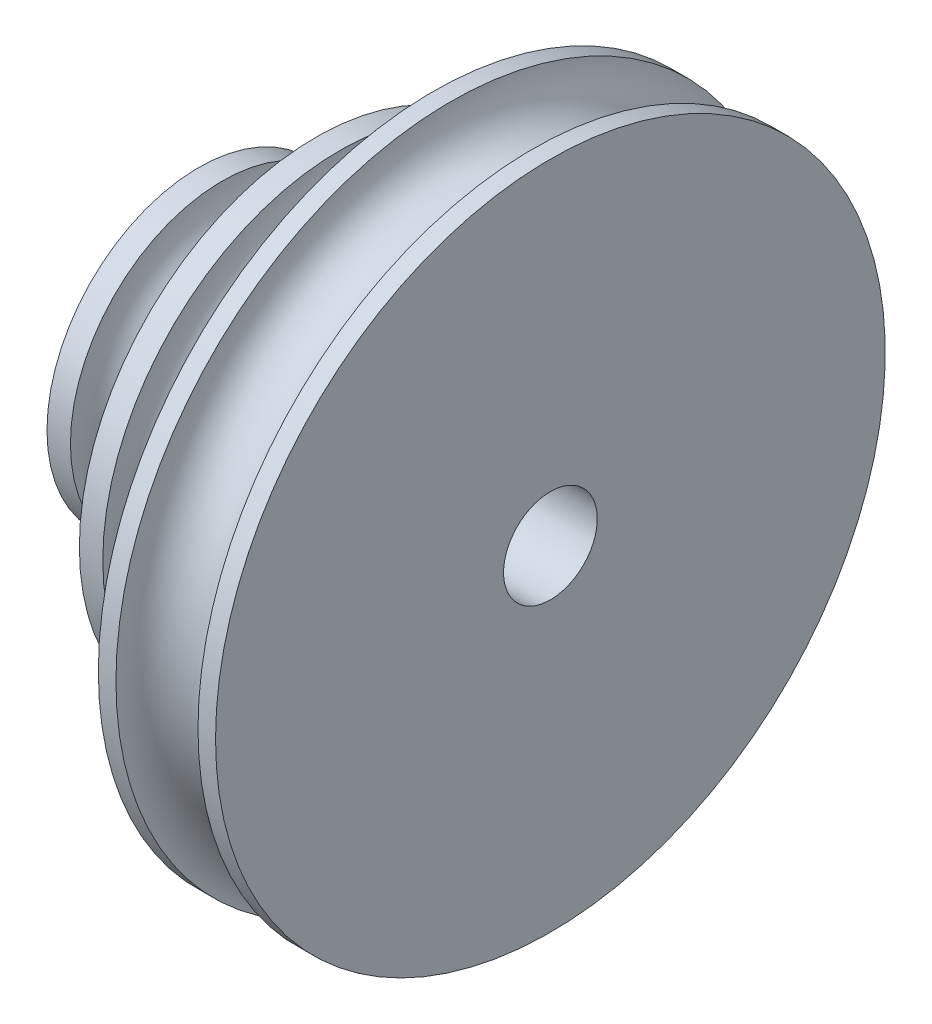
ISO-10303-21;
HEADER;
FILE_DESCRIPTION(('STEP AP214'),'2;1');
FILE_NAME('part.step','',(''),(''),'','','');
FILE_SCHEMA(('AUTOMOTIVE_DESIGN { 1 0 10303 214 1 1 1 1 }'));
ENDSEC;
DATA;
#1=APPLICATION_CONTEXT('core data for automotive mechanical design processes');
#2=APPLICATION_PROTOCOL_DEFINITION('international standard','automotive_design',2000,#1);
#3=PRODUCT_CONTEXT('',#1,'mechanical');
#4=PRODUCT('Part','Part','',(#3));
#5=PRODUCT_RELATED_PRODUCT_CATEGORY('part','',(#4));
#6=PRODUCT_DEFINITION_FORMATION('','',#4);
#7=PRODUCT_DEFINITION_CONTEXT('part definition',#1,'design');
#8=PRODUCT_DEFINITION('design','',#6,#7);
#9=PRODUCT_DEFINITION_SHAPE('','',#8);
#10=(LENGTH_UNIT() NAMED_UNIT(*) SI_UNIT(.MILLI.,.METRE.));
#11=(NAMED_UNIT(*) PLANE_ANGLE_UNIT() SI_UNIT($,.RADIAN.));
#12=(NAMED_UNIT(*) SI_UNIT($,.STERADIAN.) SOLID_ANGLE_UNIT());
#13=UNCERTAINTY_MEASURE_WITH_UNIT(LENGTH_MEASURE(1.E-05),#10,'distance_accuracy_value','');
#14=(GEOMETRIC_REPRESENTATION_CONTEXT(3) GLOBAL_UNCERTAINTY_ASSIGNED_CONTEXT((#13)) GLOBAL_UNIT_ASSIGNED_CONTEXT((#10,
#11,#12)) REPRESENTATION_CONTEXT('',''));
#15=CARTESIAN_POINT('',(0.,0.,0.));
#16=DIRECTION('',(0.,0.,1.));
#17=DIRECTION('',(1.,0.,0.));
#18=AXIS2_PLACEMENT_3D('',#15,#16,#17);
#19=CARTESIAN_POINT('',(-56.8989202459507,20.9428416164091,0.));
#20=DIRECTION('',(-1.,0.,0.));
#21=DIRECTION('',(0.,0.,1.));
#22=AXIS2_PLACEMENT_3D('',#19,#20,#21);
#23=CYLINDRICAL_SURFACE('',#22,20.1904761904762);
#24=CARTESIAN_POINT('',(-20.9941583411889,20.9428416164091,0.));
#25=DIRECTION('',(-1.,0.,0.));
#26=DIRECTION('',(0.,0.,1.));
#27=AXIS2_PLACEMENT_3D('',#24,#25,#26);
#28=CIRCLE('',#27,20.1904761904762);
#29=CARTESIAN_POINT('',(-20.9941583411889,20.9428416164091,20.1904761904762));
#30=VERTEX_POINT('',#29);
#31=EDGE_CURVE('E44',#30,#30,#28,.T.);
#32=ORIENTED_EDGE('',*,*,#31,.F.);
#33=EDGE_LOOP('',(#32));
#34=FACE_BOUND('',#33,.T.);
#35=CARTESIAN_POINT('',(-18.9941583411889,20.9428416164091,0.));
#36=DIRECTION('',(-1.,0.,0.));
#37=DIRECTION('',(0.,0.,1.));
#38=AXIS2_PLACEMENT_3D('',#35,#36,#37);
#39=CIRCLE('',#38,20.1904761904762);
#40=CARTESIAN_POINT('',(-18.9941583411889,20.9428416164091,20.1904761904762));
#41=VERTEX_POINT('',#40);
#42=EDGE_CURVE('E69',#41,#41,#39,.T.);
#43=ORIENTED_EDGE('',*,*,#42,.T.);
#44=EDGE_LOOP('',(#43));
#45=FACE_BOUND('',#44,.T.);
#46=ADVANCED_FACE('F33',(#34,#45),#23,.T.);
#47=CARTESIAN_POINT('',(-56.8989202459507,20.9428416164091,0.));
#48=DIRECTION('',(-1.,0.,0.));
#49=DIRECTION('',(0.,0.,1.));
#50=AXIS2_PLACEMENT_3D('',#47,#48,#49);
#51=CYLINDRICAL_SURFACE('',#50,28.5714285714285);
#52=CARTESIAN_POINT('',(-0.994158341188892,20.9428416164091,0.));
#53=DIRECTION('',(-1.,0.,0.));
#54=DIRECTION('',(0.,0.,1.));
#55=AXIS2_PLACEMENT_3D('',#52,#53,#54);
#56=CIRCLE('',#55,28.5714285714285);
#57=CARTESIAN_POINT('',(-0.994158341188892,20.9428416164091,28.5714285714285));
#58=VERTEX_POINT('',#57);
#59=EDGE_CURVE('E53',#58,#58,#56,.T.);
#60=ORIENTED_EDGE('',*,*,#59,.T.);
#61=EDGE_LOOP('',(#60));
#62=FACE_BOUND('',#61,.T.);
#63=CARTESIAN_POINT('',(-2.49415834118889,20.9428416164091,0.));
#64=DIRECTION('',(-1.,0.,0.));
#65=DIRECTION('',(0.,0.,1.));
#66=AXIS2_PLACEMENT_3D('',#63,#64,#65);
#67=CIRCLE('',#66,28.5714285714285);
#68=CARTESIAN_POINT('',(-2.49415834118889,20.9428416164091,28.5714285714285));
#69=VERTEX_POINT('',#68);
#70=EDGE_CURVE('E66',#69,#69,#67,.T.);
#71=ORIENTED_EDGE('',*,*,#70,.F.);
#72=EDGE_LOOP('',(#71));
#73=FACE_BOUND('',#72,.T.);
#74=ADVANCED_FACE('F93',(#62,#73),#51,.T.);
#75=CARTESIAN_POINT('',(-56.8989202459507,20.9428416164091,0.));
#76=DIRECTION('',(-1.,0.,0.));
#77=DIRECTION('',(0.,0.,1.));
#78=AXIS2_PLACEMENT_3D('',#75,#76,#77);
#79=CYLINDRICAL_SURFACE('',#78,12.9523809523809);
#80=CARTESIAN_POINT('',(-30.9941583411889,20.9428416164091,0.));
#81=DIRECTION('',(-1.,0.,0.));
#82=DIRECTION('',(0.,0.,1.));
#83=AXIS2_PLACEMENT_3D('',#80,#81,#82);
#84=CIRCLE('',#83,12.9523809523809);
#85=CARTESIAN_POINT('',(-30.9941583411889,20.9428416164091,12.9523809523809));
#86=VERTEX_POINT('',#85);
#87=EDGE_CURVE('E40',#86,#86,#84,.T.);
#88=ORIENTED_EDGE('',*,*,#87,.F.);
#89=EDGE_LOOP('',(#88));
#90=FACE_BOUND('',#89,.T.);
#91=CARTESIAN_POINT('',(-28.9941583411889,20.9428416164091,0.));
#92=DIRECTION('',(-1.,0.,0.));
#93=DIRECTION('',(0.,0.,1.));
#94=AXIS2_PLACEMENT_3D('',#91,#92,#93);
#95=CIRCLE('',#94,12.9523809523809);
#96=CARTESIAN_POINT('',(-28.9941583411889,20.9428416164091,12.9523809523809));
#97=VERTEX_POINT('',#96);
#98=EDGE_CURVE('E62',#97,#97,#95,.T.);
#99=ORIENTED_EDGE('',*,*,#98,.T.);
#100=EDGE_LOOP('',(#99));
#101=FACE_BOUND('',#100,.T.);
#102=ADVANCED_FACE('F100',(#90,#101),#79,.T.);
#103=CARTESIAN_POINT('',(-56.8989202459507,20.9428416164091,0.));
#104=DIRECTION('',(-1.,0.,0.));
#105=DIRECTION('',(0.,0.,1.));
#106=AXIS2_PLACEMENT_3D('',#103,#104,#105);
#107=CYLINDRICAL_SURFACE('',#106,4.);
#108=CARTESIAN_POINT('',(-0.994158341188885,20.9428416164091,0.));
#109=DIRECTION('',(-1.,0.,0.));
#110=DIRECTION('',(0.,0.,1.));
#111=AXIS2_PLACEMENT_3D('',#108,#109,#110);
#112=CIRCLE('',#111,4.);
#113=CARTESIAN_POINT('',(-0.994158341188885,20.9428416164091,4.));
#114=VERTEX_POINT('',#113);
#115=EDGE_CURVE('E56',#114,#114,#112,.T.);
#116=ORIENTED_EDGE('',*,*,#115,.F.);
#117=EDGE_LOOP('',(#116));
#118=FACE_BOUND('',#117,.T.);
#119=CARTESIAN_POINT('',(-30.9941583411889,20.9428416164091,0.));
#120=DIRECTION('',(-1.,0.,0.));
#121=DIRECTION('',(0.,0.,1.));
#122=AXIS2_PLACEMENT_3D('',#119,#120,#121);
#123=CIRCLE('',#122,4.);
#124=CARTESIAN_POINT('',(-30.9941583411889,20.9428416164091,4.));
#125=VERTEX_POINT('',#124);
#126=EDGE_CURVE('E10',#125,#125,#123,.T.);
#127=ORIENTED_EDGE('',*,*,#126,.T.);
#128=EDGE_LOOP('',(#127));
#129=FACE_BOUND('',#128,.T.);
#130=ADVANCED_FACE('F35',(#118,#129),#107,.F.);
#131=CARTESIAN_POINT('',(-30.9941583411889,24.9428416164091,0.));
#132=DIRECTION('',(1.,0.,0.));
#133=DIRECTION('',(0.,0.,-1.));
#134=AXIS2_PLACEMENT_3D('',#131,#132,#133);
#135=PLANE('',#134);
#136=ORIENTED_EDGE('',*,*,#126,.F.);
#137=EDGE_LOOP('',(#136));
#138=FACE_BOUND('',#137,.T.);
#139=ORIENTED_EDGE('',*,*,#87,.T.);
#140=EDGE_LOOP('',(#139));
#141=FACE_BOUND('',#140,.T.);
#142=ADVANCED_FACE('F109',(#138,#141),#135,.F.);
#143=CARTESIAN_POINT('',(-20.9941583411889,33.8952225687901,0.));
#144=DIRECTION('',(1.,0.,0.));
#145=DIRECTION('',(0.,0.,-1.));
#146=AXIS2_PLACEMENT_3D('',#143,#144,#145);
#147=PLANE('',#146);
#148=CARTESIAN_POINT('',(-20.9941583411889,20.9428416164091,0.));
#149=DIRECTION('',(-1.,0.,0.));
#150=DIRECTION('',(0.,0.,1.));
#151=AXIS2_PLACEMENT_3D('',#148,#149,#150);
#152=CIRCLE('',#151,12.9523809523809);
#153=CARTESIAN_POINT('',(-20.9941583411889,20.9428416164091,12.9523809523809));
#154=VERTEX_POINT('',#153);
#155=EDGE_CURVE('E59',#154,#154,#152,.T.);
#156=ORIENTED_EDGE('',*,*,#155,.F.);
#157=EDGE_LOOP('',(#156));
#158=FACE_BOUND('',#157,.T.);
#159=ORIENTED_EDGE('',*,*,#31,.T.);
#160=EDGE_LOOP('',(#159));
#161=FACE_BOUND('',#160,.T.);
#162=ADVANCED_FACE('F105',(#158,#161),#147,.F.);
#163=CARTESIAN_POINT('',(-0.994158341188886,49.5142701878377,0.));
#164=DIRECTION('',(-1.,0.,0.));
#165=DIRECTION('',(0.,0.,1.));
#166=AXIS2_PLACEMENT_3D('',#163,#164,#165);
#167=PLANE('',#166);
#168=ORIENTED_EDGE('',*,*,#59,.F.);
#169=EDGE_LOOP('',(#168));
#170=FACE_BOUND('',#169,.T.);
#171=ORIENTED_EDGE('',*,*,#115,.T.);
#172=EDGE_LOOP('',(#171));
#173=FACE_BOUND('',#172,.T.);
#174=ADVANCED_FACE('F108',(#170,#173),#167,.F.);
#175=CARTESIAN_POINT('',(-24.9941583411889,20.9428416164091,0.));
#176=DIRECTION('',(-1.,0.,0.));
#177=DIRECTION('',(0.,0.,1.));
#178=AXIS2_PLACEMENT_3D('',#175,#176,#177);
#179=TOROIDAL_SURFACE('',#178,12.9523809523809,4.);
#180=ORIENTED_EDGE('',*,*,#155,.T.);
#181=EDGE_LOOP('',(#180));
#182=FACE_BOUND('',#181,.T.);
#183=ORIENTED_EDGE('',*,*,#98,.F.);
#184=EDGE_LOOP('',(#183));
#185=FACE_BOUND('',#184,.T.);
#186=ADVANCED_FACE('F124',(#182,#185),#179,.F.);
#187=CARTESIAN_POINT('',(-5.99415834118889,20.9428416164091,0.));
#188=DIRECTION('',(-1.,0.,0.));
#189=DIRECTION('',(0.,0.,1.));
#190=AXIS2_PLACEMENT_3D('',#187,#188,#189);
#191=TOROIDAL_SURFACE('',#190,28.5714285714285,3.5);
#192=ORIENTED_EDGE('',*,*,#70,.T.);
#193=EDGE_LOOP('',(#192));
#194=FACE_BOUND('',#193,.T.);
#195=CARTESIAN_POINT('',(-9.49415834118889,20.9428416164091,0.));
#196=DIRECTION('',(-1.,0.,0.));
#197=DIRECTION('',(0.,0.,1.));
#198=AXIS2_PLACEMENT_3D('',#195,#196,#197);
#199=CIRCLE('',#198,28.5714285714285);
#200=CARTESIAN_POINT('',(-9.49415834118889,20.9428416164091,28.5714285714285));
#201=VERTEX_POINT('',#200);
#202=EDGE_CURVE('E70',#201,#201,#199,.T.);
#203=ORIENTED_EDGE('',*,*,#202,.F.);
#204=EDGE_LOOP('',(#203));
#205=FACE_BOUND('',#204,.T.);
#206=ADVANCED_FACE('F130',(#194,#205),#191,.F.);
#207=CARTESIAN_POINT('',(-10.9941583411889,20.9428416164091,0.));
#208=DIRECTION('',(-1.,0.,0.));
#209=DIRECTION('',(0.,0.,1.));
#210=AXIS2_PLACEMENT_3D('',#207,#208,#209);
#211=CIRCLE('',#210,28.5714285714285);
#212=CARTESIAN_POINT('',(-10.9941583411889,20.9428416164091,28.5714285714285));
#213=VERTEX_POINT('',#212);
#214=EDGE_CURVE('E48',#213,#213,#211,.T.);
#215=ORIENTED_EDGE('',*,*,#214,.F.);
#216=EDGE_LOOP('',(#215));
#217=FACE_BOUND('',#216,.T.);
#218=ORIENTED_EDGE('',*,*,#202,.T.);
#219=EDGE_LOOP('',(#218));
#220=FACE_BOUND('',#219,.T.);
#221=ADVANCED_FACE('F88',(#217,#220),#51,.T.);
#222=CARTESIAN_POINT('',(-10.9941583411889,41.1333178068853,0.));
#223=DIRECTION('',(1.,0.,0.));
#224=DIRECTION('',(0.,0.,-1.));
#225=AXIS2_PLACEMENT_3D('',#222,#223,#224);
#226=PLANE('',#225);
#227=CARTESIAN_POINT('',(-10.9941583411889,20.9428416164091,0.));
#228=DIRECTION('',(-1.,0.,0.));
#229=DIRECTION('',(0.,0.,1.));
#230=AXIS2_PLACEMENT_3D('',#227,#228,#229);
#231=CIRCLE('',#230,20.1904761904762);
#232=CARTESIAN_POINT('',(-10.9941583411889,20.9428416164091,20.1904761904762));
#233=VERTEX_POINT('',#232);
#234=EDGE_CURVE('E65',#233,#233,#231,.T.);
#235=ORIENTED_EDGE('',*,*,#234,.F.);
#236=EDGE_LOOP('',(#235));
#237=FACE_BOUND('',#236,.T.);
#238=ORIENTED_EDGE('',*,*,#214,.T.);
#239=EDGE_LOOP('',(#238));
#240=FACE_BOUND('',#239,.T.);
#241=ADVANCED_FACE('F81',(#237,#240),#226,.F.);
#242=CARTESIAN_POINT('',(-14.9941583411889,20.9428416164091,0.));
#243=DIRECTION('',(-1.,0.,0.));
#244=DIRECTION('',(0.,0.,1.));
#245=AXIS2_PLACEMENT_3D('',#242,#243,#244);
#246=TOROIDAL_SURFACE('',#245,20.1904761904762,4.);
#247=ORIENTED_EDGE('',*,*,#234,.T.);
#248=EDGE_LOOP('',(#247));
#249=FACE_BOUND('',#248,.T.);
#250=ORIENTED_EDGE('',*,*,#42,.F.);
#251=EDGE_LOOP('',(#250));
#252=FACE_BOUND('',#251,.T.);
#253=ADVANCED_FACE('F79',(#249,#252),#246,.F.);
#254=CLOSED_SHELL('',(#46,#74,#102,#130,#142,#162,#174,#186,#206,#221,#241,#253));
#255=MANIFOLD_SOLID_BREP('B2',#254);
#256=ADVANCED_BREP_SHAPE_REPRESENTATION('',(#18,#255),#14);
#257=SHAPE_DEFINITION_REPRESENTATION(#9,#256);
ENDSEC;
END-ISO-10303-21;
